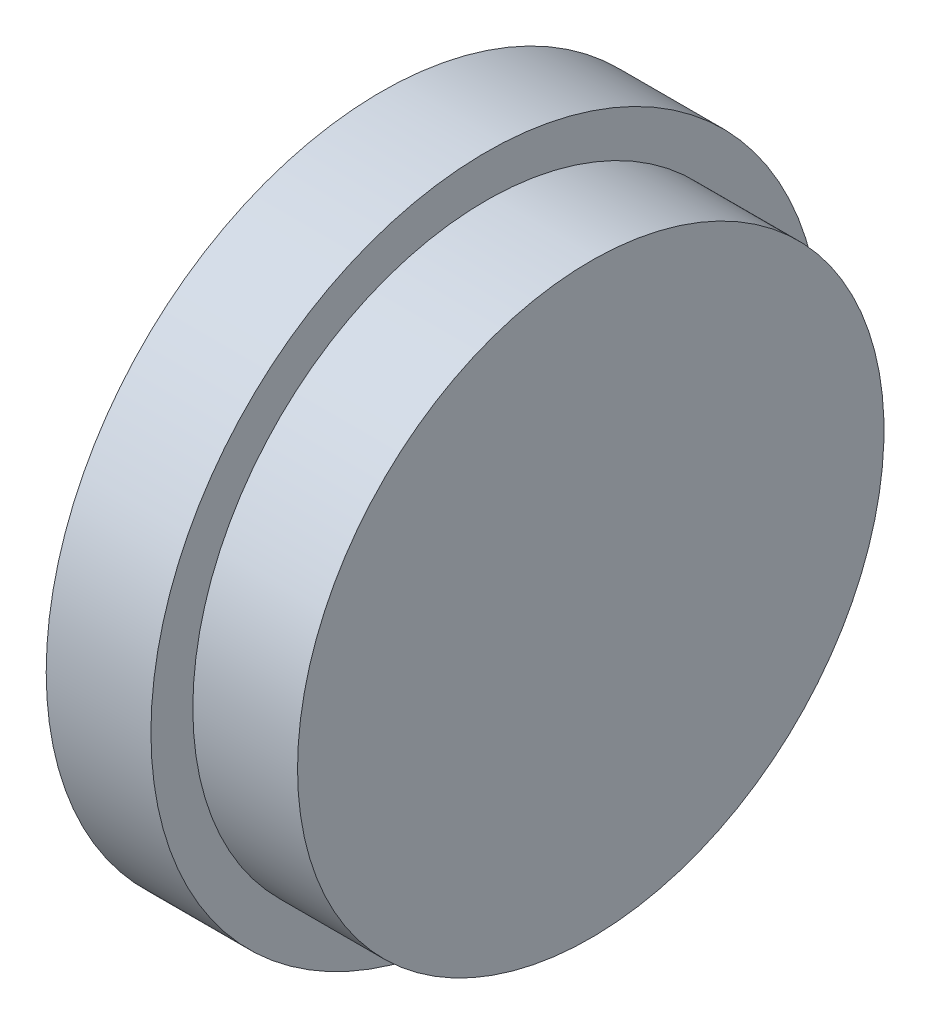
ISO-10303-21;
HEADER;
FILE_DESCRIPTION(('STEP AP214'),'2;1');
FILE_NAME('part.step','',(''),(''),'','','');
FILE_SCHEMA(('AUTOMOTIVE_DESIGN { 1 0 10303 214 1 1 1 1 }'));
ENDSEC;
DATA;
#1=APPLICATION_CONTEXT('core data for automotive mechanical design processes');
#2=APPLICATION_PROTOCOL_DEFINITION('international standard','automotive_design',2000,#1);
#3=PRODUCT_CONTEXT('',#1,'mechanical');
#4=PRODUCT('Part','Part','',(#3));
#5=PRODUCT_RELATED_PRODUCT_CATEGORY('part','',(#4));
#6=PRODUCT_DEFINITION_FORMATION('','',#4);
#7=PRODUCT_DEFINITION_CONTEXT('part definition',#1,'design');
#8=PRODUCT_DEFINITION('design','',#6,#7);
#9=PRODUCT_DEFINITION_SHAPE('','',#8);
#10=(LENGTH_UNIT() NAMED_UNIT(*) SI_UNIT(.MILLI.,.METRE.));
#11=(NAMED_UNIT(*) PLANE_ANGLE_UNIT() SI_UNIT($,.RADIAN.));
#12=(NAMED_UNIT(*) SI_UNIT($,.STERADIAN.) SOLID_ANGLE_UNIT());
#13=UNCERTAINTY_MEASURE_WITH_UNIT(LENGTH_MEASURE(1.E-05),#10,'distance_accuracy_value','');
#14=(GEOMETRIC_REPRESENTATION_CONTEXT(3) GLOBAL_UNCERTAINTY_ASSIGNED_CONTEXT((#13)) GLOBAL_UNIT_ASSIGNED_CONTEXT((#10,
#11,#12)) REPRESENTATION_CONTEXT('',''));
#15=CARTESIAN_POINT('',(0.,0.,0.));
#16=DIRECTION('',(0.,0.,1.));
#17=DIRECTION('',(1.,0.,0.));
#18=AXIS2_PLACEMENT_3D('',#15,#16,#17);
#19=CARTESIAN_POINT('',(0.,0.,0.));
#20=DIRECTION('',(1.,0.,0.));
#21=DIRECTION('',(0.,0.,-1.));
#22=AXIS2_PLACEMENT_3D('',#19,#20,#21);
#23=PLANE('',#22);
#24=CARTESIAN_POINT('',(0.,0.,0.));
#25=DIRECTION('',(-1.,0.,0.));
#26=DIRECTION('',(0.,0.,1.));
#27=AXIS2_PLACEMENT_3D('',#24,#25,#26);
#28=CIRCLE('',#27,8.);
#29=CARTESIAN_POINT('',(0.,0.,8.00000000000002));
#30=VERTEX_POINT('',#29);
#31=EDGE_CURVE('E12',#30,#30,#28,.T.);
#32=ORIENTED_EDGE('',*,*,#31,.T.);
#33=EDGE_LOOP('',(#32));
#34=FACE_BOUND('',#33,.T.);
#35=ADVANCED_FACE('F45',(#34),#23,.F.);
#36=CARTESIAN_POINT('',(0.,0.,0.));
#37=DIRECTION('',(-1.,0.,0.));
#38=DIRECTION('',(0.,0.,1.));
#39=AXIS2_PLACEMENT_3D('',#36,#37,#38);
#40=CYLINDRICAL_SURFACE('',#39,8.);
#41=ORIENTED_EDGE('',*,*,#31,.F.);
#42=EDGE_LOOP('',(#41));
#43=FACE_BOUND('',#42,.T.);
#44=CARTESIAN_POINT('',(2.5,0.,0.));
#45=DIRECTION('',(-1.,0.,0.));
#46=DIRECTION('',(0.,0.,1.));
#47=AXIS2_PLACEMENT_3D('',#44,#45,#46);
#48=CIRCLE('',#47,8.);
#49=CARTESIAN_POINT('',(2.5,0.,8.00000000000002));
#50=VERTEX_POINT('',#49);
#51=EDGE_CURVE('E51',#50,#50,#48,.T.);
#52=ORIENTED_EDGE('',*,*,#51,.T.);
#53=EDGE_LOOP('',(#52));
#54=FACE_BOUND('',#53,.T.);
#55=ADVANCED_FACE('F77',(#43,#54),#40,.T.);
#56=CARTESIAN_POINT('',(2.5,8.,0.));
#57=DIRECTION('',(-1.,0.,0.));
#58=DIRECTION('',(0.,0.,1.));
#59=AXIS2_PLACEMENT_3D('',#56,#57,#58);
#60=PLANE('',#59);
#61=ORIENTED_EDGE('',*,*,#51,.F.);
#62=EDGE_LOOP('',(#61));
#63=FACE_BOUND('',#62,.T.);
#64=CARTESIAN_POINT('',(2.5,0.,0.));
#65=DIRECTION('',(-1.,0.,0.));
#66=DIRECTION('',(0.,0.,1.));
#67=AXIS2_PLACEMENT_3D('',#64,#65,#66);
#68=CIRCLE('',#67,7.);
#69=CARTESIAN_POINT('',(2.5,0.,7.00000000000002));
#70=VERTEX_POINT('',#69);
#71=EDGE_CURVE('E55',#70,#70,#68,.T.);
#72=ORIENTED_EDGE('',*,*,#71,.T.);
#73=EDGE_LOOP('',(#72));
#74=FACE_BOUND('',#73,.T.);
#75=ADVANCED_FACE('F73',(#63,#74),#60,.F.);
#76=CARTESIAN_POINT('',(0.,0.,0.));
#77=DIRECTION('',(-1.,0.,0.));
#78=DIRECTION('',(0.,0.,1.));
#79=AXIS2_PLACEMENT_3D('',#76,#77,#78);
#80=CYLINDRICAL_SURFACE('',#79,7.);
#81=ORIENTED_EDGE('',*,*,#71,.F.);
#82=EDGE_LOOP('',(#81));
#83=FACE_BOUND('',#82,.T.);
#84=CARTESIAN_POINT('',(5.,0.,0.));
#85=DIRECTION('',(-1.,0.,0.));
#86=DIRECTION('',(0.,0.,1.));
#87=AXIS2_PLACEMENT_3D('',#84,#85,#86);
#88=CIRCLE('',#87,7.);
#89=CARTESIAN_POINT('',(5.,0.,7.00000000000002));
#90=VERTEX_POINT('',#89);
#91=EDGE_CURVE('E59',#90,#90,#88,.T.);
#92=ORIENTED_EDGE('',*,*,#91,.T.);
#93=EDGE_LOOP('',(#92));
#94=FACE_BOUND('',#93,.T.);
#95=ADVANCED_FACE('F65',(#83,#94),#80,.T.);
#96=CARTESIAN_POINT('',(5.,7.00000000000001,0.));
#97=DIRECTION('',(-1.,0.,0.));
#98=DIRECTION('',(0.,0.,1.));
#99=AXIS2_PLACEMENT_3D('',#96,#97,#98);
#100=PLANE('',#99);
#101=ORIENTED_EDGE('',*,*,#91,.F.);
#102=EDGE_LOOP('',(#101));
#103=FACE_BOUND('',#102,.T.);
#104=ADVANCED_FACE('F67',(#103),#100,.F.);
#105=CLOSED_SHELL('',(#35,#55,#75,#95,#104));
#106=MANIFOLD_SOLID_BREP('B2',#105);
#107=ADVANCED_BREP_SHAPE_REPRESENTATION('',(#18,#106),#14);
#108=SHAPE_DEFINITION_REPRESENTATION(#9,#107);
ENDSEC;
END-ISO-10303-21;
